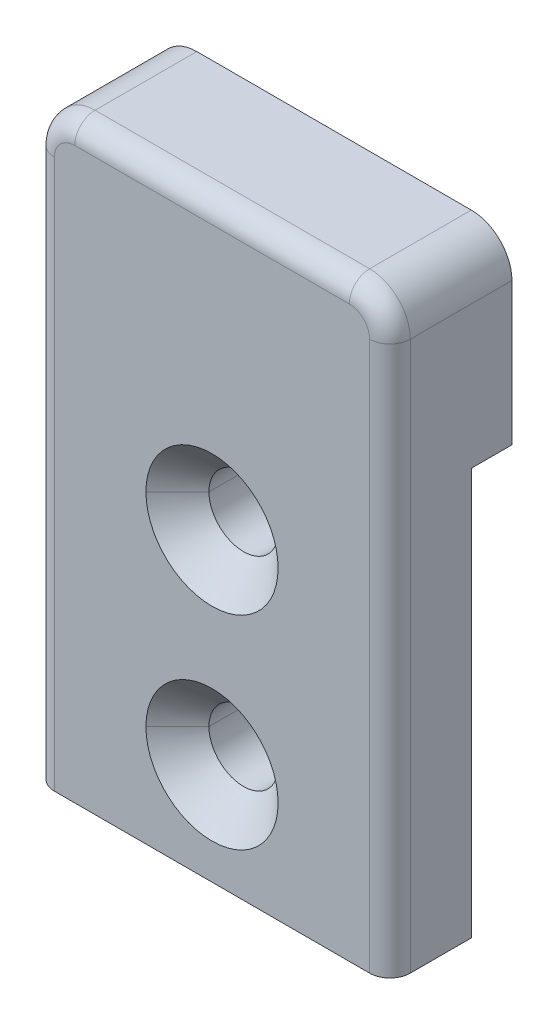
ISO-10303-21;
HEADER;
FILE_DESCRIPTION(('STEP AP214'),'2;1');
FILE_NAME('part.step','',(''),(''),'','','');
FILE_SCHEMA(('AUTOMOTIVE_DESIGN { 1 0 10303 214 1 1 1 1 }'));
ENDSEC;
DATA;
#1=APPLICATION_CONTEXT('core data for automotive mechanical design processes');
#2=APPLICATION_PROTOCOL_DEFINITION('international standard','automotive_design',2000,#1);
#3=PRODUCT_CONTEXT('',#1,'mechanical');
#4=PRODUCT('Part','Part','',(#3));
#5=PRODUCT_RELATED_PRODUCT_CATEGORY('part','',(#4));
#6=PRODUCT_DEFINITION_FORMATION('','',#4);
#7=PRODUCT_DEFINITION_CONTEXT('part definition',#1,'design');
#8=PRODUCT_DEFINITION('design','',#6,#7);
#9=PRODUCT_DEFINITION_SHAPE('','',#8);
#10=(LENGTH_UNIT() NAMED_UNIT(*) SI_UNIT(.MILLI.,.METRE.));
#11=(NAMED_UNIT(*) PLANE_ANGLE_UNIT() SI_UNIT($,.RADIAN.));
#12=(NAMED_UNIT(*) SI_UNIT($,.STERADIAN.) SOLID_ANGLE_UNIT());
#13=UNCERTAINTY_MEASURE_WITH_UNIT(LENGTH_MEASURE(1.E-05),#10,'distance_accuracy_value','');
#14=(GEOMETRIC_REPRESENTATION_CONTEXT(3) GLOBAL_UNCERTAINTY_ASSIGNED_CONTEXT((#13)) GLOBAL_UNIT_ASSIGNED_CONTEXT((#10,
#11,#12)) REPRESENTATION_CONTEXT('',''));
#15=CARTESIAN_POINT('',(0.,0.,0.));
#16=DIRECTION('',(0.,0.,1.));
#17=DIRECTION('',(1.,0.,0.));
#18=AXIS2_PLACEMENT_3D('',#15,#16,#17);
#19=CARTESIAN_POINT('',(-10.,10.,0.));
#20=DIRECTION('',(0.,1.,0.));
#21=DIRECTION('',(0.,0.,-1.));
#22=AXIS2_PLACEMENT_3D('',#19,#20,#21);
#23=PLANE('',#22);
#24=DIRECTION('',(0.,0.,1.));
#25=VECTOR('',#24,1.);
#26=CARTESIAN_POINT('',(7.5,10.,0.));
#27=LINE('',#26,#25);
#28=CARTESIAN_POINT('',(7.5,10.,0.));
#29=VERTEX_POINT('',#28);
#30=CARTESIAN_POINT('',(7.5,10.,2.));
#31=VERTEX_POINT('',#30);
#32=EDGE_CURVE('E299',#29,#31,#27,.T.);
#33=ORIENTED_EDGE('',*,*,#32,.T.);
#34=DIRECTION('',(1.,0.,0.));
#35=VECTOR('',#34,1.);
#36=CARTESIAN_POINT('',(-10.,10.,2.));
#37=LINE('',#36,#35);
#38=CARTESIAN_POINT('',(-10.,10.,2.));
#39=VERTEX_POINT('',#38);
#40=EDGE_CURVE('E11',#39,#31,#37,.T.);
#41=ORIENTED_EDGE('',*,*,#40,.F.);
#42=DIRECTION('',(0.,0.,1.));
#43=VECTOR('',#42,1.);
#44=CARTESIAN_POINT('',(-10.,10.,0.));
#45=LINE('',#44,#43);
#46=CARTESIAN_POINT('',(-10.,10.,0.));
#47=VERTEX_POINT('',#46);
#48=EDGE_CURVE('E239',#47,#39,#45,.T.);
#49=ORIENTED_EDGE('',*,*,#48,.F.);
#50=DIRECTION('',(1.,0.,0.));
#51=VECTOR('',#50,1.);
#52=CARTESIAN_POINT('',(-10.,10.,0.));
#53=LINE('',#52,#51);
#54=EDGE_CURVE('E242',#47,#29,#53,.T.);
#55=ORIENTED_EDGE('',*,*,#54,.T.);
#56=EDGE_LOOP('',(#33,#41,#49,#55));
#57=FACE_BOUND('',#56,.T.);
#58=ADVANCED_FACE('F17',(#57),#23,.F.);
#59=CARTESIAN_POINT('',(-10.,10.,2.));
#60=DIRECTION('',(0.,0.,1.));
#61=DIRECTION('',(0.,-1.,0.));
#62=AXIS2_PLACEMENT_3D('',#59,#60,#61);
#63=PLANE('',#62);
#64=CARTESIAN_POINT('',(-1.24999999999986,-5.,2.));
#65=DIRECTION('',(0.,0.,-1.));
#66=DIRECTION('',(0.,-1.,0.));
#67=AXIS2_PLACEMENT_3D('',#64,#65,#66);
#68=CIRCLE('',#67,1.7);
#69=CARTESIAN_POINT('',(0.450000000000135,-5.,2.));
#70=VERTEX_POINT('',#69);
#71=CARTESIAN_POINT('',(-2.94999999999987,-5.,2.));
#72=VERTEX_POINT('',#71);
#73=EDGE_CURVE('E439',#70,#72,#68,.T.);
#74=ORIENTED_EDGE('',*,*,#73,.F.);
#75=CARTESIAN_POINT('',(-1.24999999999986,-5.,2.));
#76=DIRECTION('',(0.,0.,-1.));
#77=DIRECTION('',(0.,-1.,0.));
#78=AXIS2_PLACEMENT_3D('',#75,#76,#77);
#79=CIRCLE('',#78,1.7);
#80=EDGE_CURVE('E364',#72,#70,#79,.T.);
#81=ORIENTED_EDGE('',*,*,#80,.F.);
#82=EDGE_LOOP('',(#74,#81));
#83=FACE_BOUND('',#82,.T.);
#84=CARTESIAN_POINT('',(-1.24999999999987,5.,2.));
#85=DIRECTION('',(0.,0.,-1.));
#86=DIRECTION('',(0.,-1.,0.));
#87=AXIS2_PLACEMENT_3D('',#84,#85,#86);
#88=CIRCLE('',#87,1.7);
#89=CARTESIAN_POINT('',(0.450000000000133,5.,2.));
#90=VERTEX_POINT('',#89);
#91=CARTESIAN_POINT('',(-2.94999999999987,5.,2.));
#92=VERTEX_POINT('',#91);
#93=EDGE_CURVE('E418',#90,#92,#88,.T.);
#94=ORIENTED_EDGE('',*,*,#93,.F.);
#95=CARTESIAN_POINT('',(-1.24999999999987,5.,2.));
#96=DIRECTION('',(0.,0.,-1.));
#97=DIRECTION('',(0.,-1.,0.));
#98=AXIS2_PLACEMENT_3D('',#95,#96,#97);
#99=CIRCLE('',#98,1.7);
#100=EDGE_CURVE('E342',#92,#90,#99,.T.);
#101=ORIENTED_EDGE('',*,*,#100,.F.);
#102=EDGE_LOOP('',(#94,#101));
#103=FACE_BOUND('',#102,.T.);
#104=DIRECTION('',(0.,-1.,0.));
#105=VECTOR('',#104,1.);
#106=CARTESIAN_POINT('',(7.5,10.,2.));
#107=LINE('',#106,#105);
#108=CARTESIAN_POINT('',(7.5,-10.,2.));
#109=VERTEX_POINT('',#108);
#110=EDGE_CURVE('E296',#31,#109,#107,.T.);
#111=ORIENTED_EDGE('',*,*,#110,.T.);
#112=DIRECTION('',(1.,0.,0.));
#113=VECTOR('',#112,1.);
#114=CARTESIAN_POINT('',(-10.,-10.,2.));
#115=LINE('',#114,#113);
#116=CARTESIAN_POINT('',(-10.,-10.,2.));
#117=VERTEX_POINT('',#116);
#118=EDGE_CURVE('E275',#117,#109,#115,.T.);
#119=ORIENTED_EDGE('',*,*,#118,.F.);
#120=DIRECTION('',(0.,-1.,0.));
#121=VECTOR('',#120,1.);
#122=CARTESIAN_POINT('',(-10.,10.,2.));
#123=LINE('',#122,#121);
#124=EDGE_CURVE('E307',#39,#117,#123,.T.);
#125=ORIENTED_EDGE('',*,*,#124,.F.);
#126=ORIENTED_EDGE('',*,*,#40,.T.);
#127=EDGE_LOOP('',(#111,#119,#125,#126));
#128=FACE_BOUND('',#127,.T.);
#129=ADVANCED_FACE('F567',(#83,#103,#128),#63,.F.);
#130=CARTESIAN_POINT('',(6.5,0.,5.));
#131=DIRECTION('',(0.,1.,0.));
#132=DIRECTION('',(-1.,0.,0.));
#133=AXIS2_PLACEMENT_3D('',#130,#131,#132);
#134=CYLINDRICAL_SURFACE('',#133,1.);
#135=CARTESIAN_POINT('',(6.5,-10.,5.));
#136=DIRECTION('',(0.,-1.,0.));
#137=DIRECTION('',(-1.,0.,0.));
#138=AXIS2_PLACEMENT_3D('',#135,#136,#137);
#139=CIRCLE('',#138,1.);
#140=CARTESIAN_POINT('',(7.5,-10.,5.));
#141=VERTEX_POINT('',#140);
#142=CARTESIAN_POINT('',(6.5,-10.,6.));
#143=VERTEX_POINT('',#142);
#144=EDGE_CURVE('E288',#141,#143,#139,.T.);
#145=ORIENTED_EDGE('',*,*,#144,.F.);
#146=DIRECTION('',(0.,-1.,0.));
#147=VECTOR('',#146,1.);
#148=CARTESIAN_POINT('',(7.5,10.,5.));
#149=LINE('',#148,#147);
#150=CARTESIAN_POINT('',(7.5,17.,5.));
#151=VERTEX_POINT('',#150);
#152=EDGE_CURVE('E278',#151,#141,#149,.T.);
#153=ORIENTED_EDGE('',*,*,#152,.F.);
#154=CARTESIAN_POINT('',(6.5,17.,5.));
#155=DIRECTION('',(0.,-1.,0.));
#156=DIRECTION('',(0.,0.,-1.));
#157=AXIS2_PLACEMENT_3D('',#154,#155,#156);
#158=CIRCLE('',#157,1.);
#159=CARTESIAN_POINT('',(6.5,17.,6.));
#160=VERTEX_POINT('',#159);
#161=EDGE_CURVE('E20',#151,#160,#158,.T.);
#162=ORIENTED_EDGE('',*,*,#161,.T.);
#163=DIRECTION('',(0.,1.,0.));
#164=VECTOR('',#163,1.);
#165=CARTESIAN_POINT('',(6.5,0.,6.));
#166=LINE('',#165,#164);
#167=EDGE_CURVE('E281',#143,#160,#166,.T.);
#168=ORIENTED_EDGE('',*,*,#167,.F.);
#169=EDGE_LOOP('',(#145,#153,#162,#168));
#170=FACE_BOUND('',#169,.T.);
#171=ADVANCED_FACE('F386',(#170),#134,.T.);
#172=CARTESIAN_POINT('',(5.5,17.,5.));
#173=DIRECTION('',(0.,0.,-1.));
#174=DIRECTION('',(-1.,0.,0.));
#175=AXIS2_PLACEMENT_3D('',#172,#173,#174);
#176=DEGENERATE_TOROIDAL_SURFACE('',#175,1.,1.,.T.);
#177=CARTESIAN_POINT('',(5.5,18.,5.));
#178=DIRECTION('',(1.,0.,0.));
#179=DIRECTION('',(0.,0.,-1.));
#180=AXIS2_PLACEMENT_3D('',#177,#178,#179);
#181=CIRCLE('',#180,1.);
#182=CARTESIAN_POINT('',(5.5,19.,5.));
#183=VERTEX_POINT('',#182);
#184=CARTESIAN_POINT('',(5.5,18.,6.));
#185=VERTEX_POINT('',#184);
#186=EDGE_CURVE('E371',#183,#185,#181,.T.);
#187=ORIENTED_EDGE('',*,*,#186,.T.);
#188=CARTESIAN_POINT('',(5.5,17.,6.));
#189=DIRECTION('',(0.,0.,1.));
#190=DIRECTION('',(-1.,0.,0.));
#191=AXIS2_PLACEMENT_3D('',#188,#189,#190);
#192=CIRCLE('',#191,1.);
#193=EDGE_CURVE('E292',#160,#185,#192,.T.);
#194=ORIENTED_EDGE('',*,*,#193,.F.);
#195=ORIENTED_EDGE('',*,*,#161,.F.);
#196=CARTESIAN_POINT('',(5.5,17.,5.));
#197=DIRECTION('',(0.,0.,-1.));
#198=DIRECTION('',(-1.,0.,0.));
#199=AXIS2_PLACEMENT_3D('',#196,#197,#198);
#200=CIRCLE('',#199,2.);
#201=EDGE_CURVE('E341',#183,#151,#200,.T.);
#202=ORIENTED_EDGE('',*,*,#201,.F.);
#203=EDGE_LOOP('',(#187,#194,#195,#202));
#204=FACE_BOUND('',#203,.T.);
#205=ADVANCED_FACE('F388',(#204),#176,.T.);
#206=CARTESIAN_POINT('',(0.,18.,5.));
#207=DIRECTION('',(-1.,0.,0.));
#208=DIRECTION('',(0.,-1.,0.));
#209=AXIS2_PLACEMENT_3D('',#206,#207,#208);
#210=CYLINDRICAL_SURFACE('',#209,1.);
#211=CARTESIAN_POINT('',(-8.,18.,5.));
#212=DIRECTION('',(1.,0.,0.));
#213=DIRECTION('',(0.,0.,-1.));
#214=AXIS2_PLACEMENT_3D('',#211,#212,#213);
#215=CIRCLE('',#214,1.);
#216=CARTESIAN_POINT('',(-8.,19.,5.));
#217=VERTEX_POINT('',#216);
#218=CARTESIAN_POINT('',(-8.,18.,6.));
#219=VERTEX_POINT('',#218);
#220=EDGE_CURVE('E87',#217,#219,#215,.T.);
#221=ORIENTED_EDGE('',*,*,#220,.T.);
#222=DIRECTION('',(-1.,0.,0.));
#223=VECTOR('',#222,1.);
#224=CARTESIAN_POINT('',(-8.,18.,6.));
#225=LINE('',#224,#223);
#226=EDGE_CURVE('E316',#185,#219,#225,.T.);
#227=ORIENTED_EDGE('',*,*,#226,.F.);
#228=ORIENTED_EDGE('',*,*,#186,.F.);
#229=DIRECTION('',(1.,0.,0.));
#230=VECTOR('',#229,1.);
#231=CARTESIAN_POINT('',(5.5,19.,5.));
#232=LINE('',#231,#230);
#233=EDGE_CURVE('E347',#217,#183,#232,.T.);
#234=ORIENTED_EDGE('',*,*,#233,.F.);
#235=EDGE_LOOP('',(#221,#227,#228,#234));
#236=FACE_BOUND('',#235,.T.);
#237=ADVANCED_FACE('F581',(#236),#210,.T.);
#238=CARTESIAN_POINT('',(-8.,17.,5.));
#239=DIRECTION('',(0.,0.,-1.));
#240=DIRECTION('',(-1.,0.,0.));
#241=AXIS2_PLACEMENT_3D('',#238,#239,#240);
#242=DEGENERATE_TOROIDAL_SURFACE('',#241,1.,1.,.T.);
#243=CARTESIAN_POINT('',(-9.,17.,5.));
#244=DIRECTION('',(0.,1.,0.));
#245=DIRECTION('',(0.,0.,1.));
#246=AXIS2_PLACEMENT_3D('',#243,#244,#245);
#247=CIRCLE('',#246,1.);
#248=CARTESIAN_POINT('',(-10.,17.,5.));
#249=VERTEX_POINT('',#248);
#250=CARTESIAN_POINT('',(-9.,17.,6.));
#251=VERTEX_POINT('',#250);
#252=EDGE_CURVE('E39',#249,#251,#247,.T.);
#253=ORIENTED_EDGE('',*,*,#252,.T.);
#254=CARTESIAN_POINT('',(-8.,17.,6.));
#255=DIRECTION('',(0.,0.,1.));
#256=DIRECTION('',(-1.,0.,0.));
#257=AXIS2_PLACEMENT_3D('',#254,#255,#256);
#258=CIRCLE('',#257,1.);
#259=EDGE_CURVE('E311',#219,#251,#258,.T.);
#260=ORIENTED_EDGE('',*,*,#259,.F.);
#261=ORIENTED_EDGE('',*,*,#220,.F.);
#262=CARTESIAN_POINT('',(-8.,17.,5.));
#263=DIRECTION('',(0.,0.,-1.));
#264=DIRECTION('',(-1.,0.,0.));
#265=AXIS2_PLACEMENT_3D('',#262,#263,#264);
#266=CIRCLE('',#265,2.);
#267=EDGE_CURVE('E354',#249,#217,#266,.T.);
#268=ORIENTED_EDGE('',*,*,#267,.F.);
#269=EDGE_LOOP('',(#253,#260,#261,#268));
#270=FACE_BOUND('',#269,.T.);
#271=ADVANCED_FACE('F584',(#270),#242,.T.);
#272=CARTESIAN_POINT('',(-9.,0.,5.));
#273=DIRECTION('',(0.,-1.,0.));
#274=DIRECTION('',(1.,0.,0.));
#275=AXIS2_PLACEMENT_3D('',#272,#273,#274);
#276=CYLINDRICAL_SURFACE('',#275,1.);
#277=CARTESIAN_POINT('',(-9.,-10.,5.));
#278=DIRECTION('',(0.,-1.,0.));
#279=DIRECTION('',(-1.,0.,0.));
#280=AXIS2_PLACEMENT_3D('',#277,#278,#279);
#281=CIRCLE('',#280,1.);
#282=CARTESIAN_POINT('',(-9.,-10.,6.));
#283=VERTEX_POINT('',#282);
#284=CARTESIAN_POINT('',(-10.,-10.,5.));
#285=VERTEX_POINT('',#284);
#286=EDGE_CURVE('E287',#283,#285,#281,.T.);
#287=ORIENTED_EDGE('',*,*,#286,.F.);
#288=DIRECTION('',(0.,-1.,0.));
#289=VECTOR('',#288,1.);
#290=CARTESIAN_POINT('',(-9.,-10.,6.));
#291=LINE('',#290,#289);
#292=EDGE_CURVE('E315',#251,#283,#291,.T.);
#293=ORIENTED_EDGE('',*,*,#292,.F.);
#294=ORIENTED_EDGE('',*,*,#252,.F.);
#295=DIRECTION('',(0.,1.,0.));
#296=VECTOR('',#295,1.);
#297=CARTESIAN_POINT('',(-10.,17.,5.));
#298=LINE('',#297,#296);
#299=EDGE_CURVE('E310',#285,#249,#298,.T.);
#300=ORIENTED_EDGE('',*,*,#299,.F.);
#301=EDGE_LOOP('',(#287,#293,#294,#300));
#302=FACE_BOUND('',#301,.T.);
#303=ADVANCED_FACE('F588',(#302),#276,.T.);
#304=CARTESIAN_POINT('',(-8.,17.,0.));
#305=DIRECTION('',(0.,0.,-1.));
#306=DIRECTION('',(-1.,0.,0.));
#307=AXIS2_PLACEMENT_3D('',#304,#305,#306);
#308=CYLINDRICAL_SURFACE('',#307,2.);
#309=DIRECTION('',(0.,0.,-1.));
#310=VECTOR('',#309,1.);
#311=CARTESIAN_POINT('',(-10.,17.,0.));
#312=LINE('',#311,#310);
#313=CARTESIAN_POINT('',(-10.,17.,0.));
#314=VERTEX_POINT('',#313);
#315=EDGE_CURVE('E248',#249,#314,#312,.T.);
#316=ORIENTED_EDGE('',*,*,#315,.F.);
#317=ORIENTED_EDGE('',*,*,#267,.T.);
#318=DIRECTION('',(0.,0.,1.));
#319=VECTOR('',#318,1.);
#320=CARTESIAN_POINT('',(-8.,19.,0.));
#321=LINE('',#320,#319);
#322=CARTESIAN_POINT('',(-8.,19.,0.));
#323=VERTEX_POINT('',#322);
#324=EDGE_CURVE('E330',#323,#217,#321,.T.);
#325=ORIENTED_EDGE('',*,*,#324,.F.);
#326=CARTESIAN_POINT('',(-8.,17.,0.));
#327=DIRECTION('',(0.,0.,-1.));
#328=DIRECTION('',(-1.,0.,0.));
#329=AXIS2_PLACEMENT_3D('',#326,#327,#328);
#330=CIRCLE('',#329,2.);
#331=EDGE_CURVE('E259',#314,#323,#330,.T.);
#332=ORIENTED_EDGE('',*,*,#331,.F.);
#333=EDGE_LOOP('',(#316,#317,#325,#332));
#334=FACE_BOUND('',#333,.T.);
#335=ADVANCED_FACE('F591',(#334),#308,.T.);
#336=CARTESIAN_POINT('',(5.5,17.,0.));
#337=DIRECTION('',(0.,0.,1.));
#338=DIRECTION('',(1.,0.,0.));
#339=AXIS2_PLACEMENT_3D('',#336,#337,#338);
#340=CYLINDRICAL_SURFACE('',#339,2.);
#341=DIRECTION('',(0.,0.,-1.));
#342=VECTOR('',#341,1.);
#343=CARTESIAN_POINT('',(5.5,19.,0.));
#344=LINE('',#343,#342);
#345=CARTESIAN_POINT('',(5.5,19.,0.));
#346=VERTEX_POINT('',#345);
#347=EDGE_CURVE('E75',#183,#346,#344,.T.);
#348=ORIENTED_EDGE('',*,*,#347,.F.);
#349=ORIENTED_EDGE('',*,*,#201,.T.);
#350=DIRECTION('',(0.,0.,1.));
#351=VECTOR('',#350,1.);
#352=CARTESIAN_POINT('',(7.5,17.,6.));
#353=LINE('',#352,#351);
#354=CARTESIAN_POINT('',(7.5,17.,0.));
#355=VERTEX_POINT('',#354);
#356=EDGE_CURVE('E282',#355,#151,#353,.T.);
#357=ORIENTED_EDGE('',*,*,#356,.F.);
#358=CARTESIAN_POINT('',(5.5,17.,0.));
#359=DIRECTION('',(0.,0.,-1.));
#360=DIRECTION('',(-1.,0.,0.));
#361=AXIS2_PLACEMENT_3D('',#358,#359,#360);
#362=CIRCLE('',#361,2.);
#363=EDGE_CURVE('E337',#346,#355,#362,.T.);
#364=ORIENTED_EDGE('',*,*,#363,.F.);
#365=EDGE_LOOP('',(#348,#349,#357,#364));
#366=FACE_BOUND('',#365,.T.);
#367=ADVANCED_FACE('F594',(#366),#340,.T.);
#368=CARTESIAN_POINT('',(-1.24999999999987,5.,6.));
#369=DIRECTION('',(0.,0.,1.));
#370=DIRECTION('',(1.,0.,0.));
#371=AXIS2_PLACEMENT_3D('',#368,#369,#370);
#372=CONICAL_SURFACE('',#371,3.25,0.785398163397449);
#373=DIRECTION('',(-0.707106781186548,0.,0.707106781186547));
#374=VECTOR('',#373,1.);
#375=CARTESIAN_POINT('',(-4.49999999999986,5.,6.));
#376=LINE('',#375,#374);
#377=CARTESIAN_POINT('',(-2.94999999999987,5.,4.45));
#378=VERTEX_POINT('',#377);
#379=CARTESIAN_POINT('',(-4.49999999999986,5.,6.));
#380=VERTEX_POINT('',#379);
#381=EDGE_CURVE('E417',#378,#380,#376,.T.);
#382=ORIENTED_EDGE('',*,*,#381,.F.);
#383=CARTESIAN_POINT('',(-1.24999999999987,5.,4.45));
#384=DIRECTION('',(0.,0.,1.));
#385=DIRECTION('',(1.,0.,0.));
#386=AXIS2_PLACEMENT_3D('',#383,#384,#385);
#387=CIRCLE('',#386,1.7);
#388=CARTESIAN_POINT('',(0.450000000000133,5.,4.45));
#389=VERTEX_POINT('',#388);
#390=EDGE_CURVE('E338',#389,#378,#387,.T.);
#391=ORIENTED_EDGE('',*,*,#390,.F.);
#392=DIRECTION('',(0.707106781186548,0.,0.707106781186547));
#393=VECTOR('',#392,1.);
#394=CARTESIAN_POINT('',(2.00000000000014,5.,6.));
#395=LINE('',#394,#393);
#396=CARTESIAN_POINT('',(2.00000000000014,5.,6.));
#397=VERTEX_POINT('',#396);
#398=EDGE_CURVE('E416',#389,#397,#395,.T.);
#399=ORIENTED_EDGE('',*,*,#398,.T.);
#400=CARTESIAN_POINT('',(-1.24999999999987,5.,6.));
#401=DIRECTION('',(0.,0.,1.));
#402=DIRECTION('',(1.,0.,0.));
#403=AXIS2_PLACEMENT_3D('',#400,#401,#402);
#404=CIRCLE('',#403,3.25);
#405=EDGE_CURVE('E272',#397,#380,#404,.T.);
#406=ORIENTED_EDGE('',*,*,#405,.T.);
#407=EDGE_LOOP('',(#382,#391,#399,#406));
#408=FACE_BOUND('',#407,.T.);
#409=ADVANCED_FACE('F598',(#408),#372,.F.);
#410=CARTESIAN_POINT('',(-1.24999999999987,5.,6.));
#411=DIRECTION('',(0.,0.,1.));
#412=DIRECTION('',(1.,0.,0.));
#413=AXIS2_PLACEMENT_3D('',#410,#411,#412);
#414=CYLINDRICAL_SURFACE('',#413,1.7);
#415=DIRECTION('',(0.,0.,1.));
#416=VECTOR('',#415,1.);
#417=CARTESIAN_POINT('',(-2.94999999999987,5.,6.));
#418=LINE('',#417,#416);
#419=EDGE_CURVE('E422',#92,#378,#418,.T.);
#420=ORIENTED_EDGE('',*,*,#419,.F.);
#421=ORIENTED_EDGE('',*,*,#100,.T.);
#422=DIRECTION('',(0.,0.,1.));
#423=VECTOR('',#422,1.);
#424=CARTESIAN_POINT('',(0.450000000000133,5.,6.));
#425=LINE('',#424,#423);
#426=EDGE_CURVE('E431',#90,#389,#425,.T.);
#427=ORIENTED_EDGE('',*,*,#426,.T.);
#428=ORIENTED_EDGE('',*,*,#390,.T.);
#429=EDGE_LOOP('',(#420,#421,#427,#428));
#430=FACE_BOUND('',#429,.T.);
#431=ADVANCED_FACE('F638',(#430),#414,.F.);
#432=CARTESIAN_POINT('',(-1.24999999999986,-5.,6.));
#433=DIRECTION('',(0.,0.,1.));
#434=DIRECTION('',(1.,0.,0.));
#435=AXIS2_PLACEMENT_3D('',#432,#433,#434);
#436=CONICAL_SURFACE('',#435,3.25,0.785398163397449);
#437=DIRECTION('',(-0.707106781186548,0.,0.707106781186547));
#438=VECTOR('',#437,1.);
#439=CARTESIAN_POINT('',(-4.49999999999986,-5.,6.));
#440=LINE('',#439,#438);
#441=CARTESIAN_POINT('',(-2.94999999999987,-5.,4.45));
#442=VERTEX_POINT('',#441);
#443=CARTESIAN_POINT('',(-4.49999999999986,-5.,6.));
#444=VERTEX_POINT('',#443);
#445=EDGE_CURVE('E445',#442,#444,#440,.T.);
#446=ORIENTED_EDGE('',*,*,#445,.F.);
#447=CARTESIAN_POINT('',(-1.24999999999986,-5.,4.45));
#448=DIRECTION('',(0.,0.,1.));
#449=DIRECTION('',(1.,0.,0.));
#450=AXIS2_PLACEMENT_3D('',#447,#448,#449);
#451=CIRCLE('',#450,1.7);
#452=CARTESIAN_POINT('',(0.450000000000135,-5.,4.45));
#453=VERTEX_POINT('',#452);
#454=EDGE_CURVE('E365',#453,#442,#451,.T.);
#455=ORIENTED_EDGE('',*,*,#454,.F.);
#456=DIRECTION('',(0.707106781186548,0.,0.707106781186547));
#457=VECTOR('',#456,1.);
#458=CARTESIAN_POINT('',(2.00000000000014,-5.,6.));
#459=LINE('',#458,#457);
#460=CARTESIAN_POINT('',(2.00000000000014,-5.,6.));
#461=VERTEX_POINT('',#460);
#462=EDGE_CURVE('E411',#453,#461,#459,.T.);
#463=ORIENTED_EDGE('',*,*,#462,.T.);
#464=CARTESIAN_POINT('',(-1.24999999999986,-5.,6.));
#465=DIRECTION('',(0.,0.,1.));
#466=DIRECTION('',(1.,0.,0.));
#467=AXIS2_PLACEMENT_3D('',#464,#465,#466);
#468=CIRCLE('',#467,3.25);
#469=EDGE_CURVE('E266',#461,#444,#468,.T.);
#470=ORIENTED_EDGE('',*,*,#469,.T.);
#471=EDGE_LOOP('',(#446,#455,#463,#470));
#472=FACE_BOUND('',#471,.T.);
#473=ADVANCED_FACE('F603',(#472),#436,.F.);
#474=CARTESIAN_POINT('',(-1.24999999999986,-5.,6.));
#475=DIRECTION('',(0.,0.,1.));
#476=DIRECTION('',(1.,0.,0.));
#477=AXIS2_PLACEMENT_3D('',#474,#475,#476);
#478=CYLINDRICAL_SURFACE('',#477,1.7);
#479=DIRECTION('',(0.,0.,1.));
#480=VECTOR('',#479,1.);
#481=CARTESIAN_POINT('',(-2.94999999999987,-5.,6.));
#482=LINE('',#481,#480);
#483=EDGE_CURVE('E435',#72,#442,#482,.T.);
#484=ORIENTED_EDGE('',*,*,#483,.F.);
#485=ORIENTED_EDGE('',*,*,#80,.T.);
#486=DIRECTION('',(0.,0.,1.));
#487=VECTOR('',#486,1.);
#488=CARTESIAN_POINT('',(0.450000000000135,-5.,6.));
#489=LINE('',#488,#487);
#490=EDGE_CURVE('E438',#70,#453,#489,.T.);
#491=ORIENTED_EDGE('',*,*,#490,.T.);
#492=ORIENTED_EDGE('',*,*,#454,.T.);
#493=EDGE_LOOP('',(#484,#485,#491,#492));
#494=FACE_BOUND('',#493,.T.);
#495=ADVANCED_FACE('F600',(#494),#478,.F.);
#496=CARTESIAN_POINT('',(4.,16.,0.500000000000007));
#497=DIRECTION('',(0.,0.,-1.));
#498=DIRECTION('',(-1.,0.,0.));
#499=AXIS2_PLACEMENT_3D('',#496,#497,#498);
#500=CONICAL_SURFACE('',#499,2.,0.785398163397448);
#501=DIRECTION('',(0.707106781186548,0.,-0.707106781186548));
#502=VECTOR('',#501,1.);
#503=CARTESIAN_POINT('',(6.,16.,0.500000000000007));
#504=LINE('',#503,#502);
#505=CARTESIAN_POINT('',(6.,16.,0.500000000000007));
#506=VERTEX_POINT('',#505);
#507=CARTESIAN_POINT('',(6.5,16.,0.));
#508=VERTEX_POINT('',#507);
#509=EDGE_CURVE('E472',#506,#508,#504,.T.);
#510=ORIENTED_EDGE('',*,*,#509,.F.);
#511=CARTESIAN_POINT('',(4.,16.,0.500000000000007));
#512=DIRECTION('',(0.,0.,-1.));
#513=DIRECTION('',(-1.,0.,0.));
#514=AXIS2_PLACEMENT_3D('',#511,#512,#513);
#515=CIRCLE('',#514,2.);
#516=CARTESIAN_POINT('',(2.,16.,0.500000000000007));
#517=VERTEX_POINT('',#516);
#518=EDGE_CURVE('E361',#517,#506,#515,.T.);
#519=ORIENTED_EDGE('',*,*,#518,.F.);
#520=DIRECTION('',(-0.707106781186548,0.,-0.707106781186548));
#521=VECTOR('',#520,1.);
#522=CARTESIAN_POINT('',(2.,16.,0.500000000000007));
#523=LINE('',#522,#521);
#524=CARTESIAN_POINT('',(1.5,16.,0.));
#525=VERTEX_POINT('',#524);
#526=EDGE_CURVE('E474',#517,#525,#523,.T.);
#527=ORIENTED_EDGE('',*,*,#526,.T.);
#528=CARTESIAN_POINT('',(4.,16.,0.));
#529=DIRECTION('',(0.,0.,1.));
#530=DIRECTION('',(-1.,0.,0.));
#531=AXIS2_PLACEMENT_3D('',#528,#529,#530);
#532=CIRCLE('',#531,2.5);
#533=EDGE_CURVE('E327',#508,#525,#532,.T.);
#534=ORIENTED_EDGE('',*,*,#533,.F.);
#535=EDGE_LOOP('',(#510,#519,#527,#534));
#536=FACE_BOUND('',#535,.T.);
#537=ADVANCED_FACE('F564',(#536),#500,.F.);
#538=CARTESIAN_POINT('',(-6.5,16.,0.500000000000007));
#539=DIRECTION('',(0.,0.,-1.));
#540=DIRECTION('',(-1.,0.,0.));
#541=AXIS2_PLACEMENT_3D('',#538,#539,#540);
#542=CONICAL_SURFACE('',#541,2.,0.785398163397448);
#543=DIRECTION('',(0.707106781186548,0.,-0.707106781186548));
#544=VECTOR('',#543,1.);
#545=CARTESIAN_POINT('',(-4.5,16.,0.500000000000007));
#546=LINE('',#545,#544);
#547=CARTESIAN_POINT('',(-4.5,16.,0.500000000000007));
#548=VERTEX_POINT('',#547);
#549=CARTESIAN_POINT('',(-4.,16.,0.));
#550=VERTEX_POINT('',#549);
#551=EDGE_CURVE('E482',#548,#550,#546,.T.);
#552=ORIENTED_EDGE('',*,*,#551,.F.);
#553=CARTESIAN_POINT('',(-6.5,16.,0.500000000000007));
#554=DIRECTION('',(0.,0.,-1.));
#555=DIRECTION('',(-1.,0.,0.));
#556=AXIS2_PLACEMENT_3D('',#553,#554,#555);
#557=CIRCLE('',#556,2.);
#558=CARTESIAN_POINT('',(-8.5,16.,0.500000000000007));
#559=VERTEX_POINT('',#558);
#560=EDGE_CURVE('E360',#559,#548,#557,.T.);
#561=ORIENTED_EDGE('',*,*,#560,.F.);
#562=DIRECTION('',(-0.707106781186548,0.,-0.707106781186548));
#563=VECTOR('',#562,1.);
#564=CARTESIAN_POINT('',(-8.5,16.,0.500000000000007));
#565=LINE('',#564,#563);
#566=CARTESIAN_POINT('',(-9.,16.,0.));
#567=VERTEX_POINT('',#566);
#568=EDGE_CURVE('E459',#559,#567,#565,.T.);
#569=ORIENTED_EDGE('',*,*,#568,.T.);
#570=CARTESIAN_POINT('',(-6.5,16.,0.));
#571=DIRECTION('',(0.,0.,1.));
#572=DIRECTION('',(-1.,0.,0.));
#573=AXIS2_PLACEMENT_3D('',#570,#571,#572);
#574=CIRCLE('',#573,2.5);
#575=EDGE_CURVE('E331',#550,#567,#574,.T.);
#576=ORIENTED_EDGE('',*,*,#575,.F.);
#577=EDGE_LOOP('',(#552,#561,#569,#576));
#578=FACE_BOUND('',#577,.T.);
#579=ADVANCED_FACE('F550',(#578),#542,.F.);
#580=CARTESIAN_POINT('',(-6.5,16.,2.5));
#581=DIRECTION('',(0.,0.,-1.));
#582=DIRECTION('',(0.,-1.,0.));
#583=AXIS2_PLACEMENT_3D('',#580,#581,#582);
#584=PLANE('',#583);
#585=CARTESIAN_POINT('',(-6.5,16.,2.5));
#586=DIRECTION('',(0.,0.,-1.));
#587=DIRECTION('',(-1.,0.,0.));
#588=AXIS2_PLACEMENT_3D('',#585,#586,#587);
#589=CIRCLE('',#588,2.);
#590=CARTESIAN_POINT('',(-8.5,16.,2.5));
#591=VERTEX_POINT('',#590);
#592=CARTESIAN_POINT('',(-4.5,16.,2.5));
#593=VERTEX_POINT('',#592);
#594=EDGE_CURVE('E357',#591,#593,#589,.T.);
#595=ORIENTED_EDGE('',*,*,#594,.T.);
#596=CARTESIAN_POINT('',(-6.5,16.,2.5));
#597=DIRECTION('',(0.,0.,-1.));
#598=DIRECTION('',(-1.,0.,0.));
#599=AXIS2_PLACEMENT_3D('',#596,#597,#598);
#600=CIRCLE('',#599,2.);
#601=EDGE_CURVE('E463',#593,#591,#600,.T.);
#602=ORIENTED_EDGE('',*,*,#601,.T.);
#603=EDGE_LOOP('',(#595,#602));
#604=FACE_BOUND('',#603,.T.);
#605=ADVANCED_FACE('F554',(#604),#584,.T.);
#606=CARTESIAN_POINT('',(-6.5,16.,2.5));
#607=DIRECTION('',(0.,0.,-1.));
#608=DIRECTION('',(-1.,0.,0.));
#609=AXIS2_PLACEMENT_3D('',#606,#607,#608);
#610=CYLINDRICAL_SURFACE('',#609,2.);
#611=DIRECTION('',(0.,0.,-1.));
#612=VECTOR('',#611,1.);
#613=CARTESIAN_POINT('',(-4.5,16.,2.5));
#614=LINE('',#613,#612);
#615=EDGE_CURVE('E492',#593,#548,#614,.T.);
#616=ORIENTED_EDGE('',*,*,#615,.F.);
#617=ORIENTED_EDGE('',*,*,#594,.F.);
#618=DIRECTION('',(0.,0.,-1.));
#619=VECTOR('',#618,1.);
#620=CARTESIAN_POINT('',(-8.5,16.,2.5));
#621=LINE('',#620,#619);
#622=EDGE_CURVE('E496',#591,#559,#621,.T.);
#623=ORIENTED_EDGE('',*,*,#622,.T.);
#624=ORIENTED_EDGE('',*,*,#560,.T.);
#625=EDGE_LOOP('',(#616,#617,#623,#624));
#626=FACE_BOUND('',#625,.T.);
#627=ADVANCED_FACE('F552',(#626),#610,.F.);
#628=CARTESIAN_POINT('',(4.,16.,2.5));
#629=DIRECTION('',(0.,0.,-1.));
#630=DIRECTION('',(0.,-1.,0.));
#631=AXIS2_PLACEMENT_3D('',#628,#629,#630);
#632=PLANE('',#631);
#633=CARTESIAN_POINT('',(4.,16.,2.5));
#634=DIRECTION('',(0.,0.,-1.));
#635=DIRECTION('',(-1.,0.,0.));
#636=AXIS2_PLACEMENT_3D('',#633,#634,#635);
#637=CIRCLE('',#636,2.);
#638=CARTESIAN_POINT('',(2.,16.,2.5));
#639=VERTEX_POINT('',#638);
#640=CARTESIAN_POINT('',(6.,16.,2.5));
#641=VERTEX_POINT('',#640);
#642=EDGE_CURVE('E247',#639,#641,#637,.T.);
#643=ORIENTED_EDGE('',*,*,#642,.T.);
#644=CARTESIAN_POINT('',(4.,16.,2.5));
#645=DIRECTION('',(0.,0.,-1.));
#646=DIRECTION('',(-1.,0.,0.));
#647=AXIS2_PLACEMENT_3D('',#644,#645,#646);
#648=CIRCLE('',#647,2.);
#649=EDGE_CURVE('E502',#641,#639,#648,.T.);
#650=ORIENTED_EDGE('',*,*,#649,.T.);
#651=EDGE_LOOP('',(#643,#650));
#652=FACE_BOUND('',#651,.T.);
#653=ADVANCED_FACE('F562',(#652),#632,.T.);
#654=CARTESIAN_POINT('',(4.,16.,2.5));
#655=DIRECTION('',(0.,0.,-1.));
#656=DIRECTION('',(-1.,0.,0.));
#657=AXIS2_PLACEMENT_3D('',#654,#655,#656);
#658=CYLINDRICAL_SURFACE('',#657,2.);
#659=DIRECTION('',(0.,0.,-1.));
#660=VECTOR('',#659,1.);
#661=CARTESIAN_POINT('',(6.,16.,2.5));
#662=LINE('',#661,#660);
#663=EDGE_CURVE('E506',#641,#506,#662,.T.);
#664=ORIENTED_EDGE('',*,*,#663,.F.);
#665=ORIENTED_EDGE('',*,*,#642,.F.);
#666=DIRECTION('',(0.,0.,-1.));
#667=VECTOR('',#666,1.);
#668=CARTESIAN_POINT('',(2.,16.,2.5));
#669=LINE('',#668,#667);
#670=EDGE_CURVE('E427',#639,#517,#669,.T.);
#671=ORIENTED_EDGE('',*,*,#670,.T.);
#672=ORIENTED_EDGE('',*,*,#518,.T.);
#673=EDGE_LOOP('',(#664,#665,#671,#672));
#674=FACE_BOUND('',#673,.T.);
#675=ADVANCED_FACE('F616',(#674),#658,.F.);
#676=CARTESIAN_POINT('',(-10.,0.,0.));
#677=DIRECTION('',(-1.,0.,0.));
#678=DIRECTION('',(0.,0.,1.));
#679=AXIS2_PLACEMENT_3D('',#676,#677,#678);
#680=PLANE('',#679);
#681=ORIENTED_EDGE('',*,*,#124,.T.);
#682=DIRECTION('',(0.,0.,1.));
#683=VECTOR('',#682,1.);
#684=CARTESIAN_POINT('',(-10.,-10.,0.));
#685=LINE('',#684,#683);
#686=EDGE_CURVE('E423',#117,#285,#685,.T.);
#687=ORIENTED_EDGE('',*,*,#686,.T.);
#688=ORIENTED_EDGE('',*,*,#299,.T.);
#689=ORIENTED_EDGE('',*,*,#315,.T.);
#690=DIRECTION('',(0.,-1.,0.));
#691=VECTOR('',#690,1.);
#692=CARTESIAN_POINT('',(-10.,19.,0.));
#693=LINE('',#692,#691);
#694=EDGE_CURVE('E251',#314,#47,#693,.T.);
#695=ORIENTED_EDGE('',*,*,#694,.T.);
#696=ORIENTED_EDGE('',*,*,#48,.T.);
#697=EDGE_LOOP('',(#681,#687,#688,#689,#695,#696));
#698=FACE_BOUND('',#697,.T.);
#699=ADVANCED_FACE('F252',(#698),#680,.T.);
#700=CARTESIAN_POINT('',(0.,19.,0.));
#701=DIRECTION('',(0.,1.,0.));
#702=DIRECTION('',(1.,0.,0.));
#703=AXIS2_PLACEMENT_3D('',#700,#701,#702);
#704=PLANE('',#703);
#705=ORIENTED_EDGE('',*,*,#324,.T.);
#706=ORIENTED_EDGE('',*,*,#233,.T.);
#707=ORIENTED_EDGE('',*,*,#347,.T.);
#708=DIRECTION('',(-1.,0.,0.));
#709=VECTOR('',#708,1.);
#710=CARTESIAN_POINT('',(7.5,19.,0.));
#711=LINE('',#710,#709);
#712=EDGE_CURVE('E334',#346,#323,#711,.T.);
#713=ORIENTED_EDGE('',*,*,#712,.T.);
#714=EDGE_LOOP('',(#705,#706,#707,#713));
#715=FACE_BOUND('',#714,.T.);
#716=ADVANCED_FACE('F623',(#715),#704,.T.);
#717=CARTESIAN_POINT('',(0.,0.,0.));
#718=DIRECTION('',(0.,0.,-1.));
#719=DIRECTION('',(0.,-1.,0.));
#720=AXIS2_PLACEMENT_3D('',#717,#718,#719);
#721=PLANE('',#720);
#722=CARTESIAN_POINT('',(4.,16.,0.));
#723=DIRECTION('',(0.,0.,1.));
#724=DIRECTION('',(-1.,0.,0.));
#725=AXIS2_PLACEMENT_3D('',#722,#723,#724);
#726=CIRCLE('',#725,2.5);
#727=EDGE_CURVE('E479',#525,#508,#726,.T.);
#728=ORIENTED_EDGE('',*,*,#727,.T.);
#729=ORIENTED_EDGE('',*,*,#533,.T.);
#730=EDGE_LOOP('',(#728,#729));
#731=FACE_BOUND('',#730,.T.);
#732=CARTESIAN_POINT('',(-6.5,16.,0.));
#733=DIRECTION('',(0.,0.,1.));
#734=DIRECTION('',(-1.,0.,0.));
#735=AXIS2_PLACEMENT_3D('',#732,#733,#734);
#736=CIRCLE('',#735,2.5);
#737=EDGE_CURVE('E464',#567,#550,#736,.T.);
#738=ORIENTED_EDGE('',*,*,#737,.T.);
#739=ORIENTED_EDGE('',*,*,#575,.T.);
#740=EDGE_LOOP('',(#738,#739));
#741=FACE_BOUND('',#740,.T.);
#742=ORIENTED_EDGE('',*,*,#54,.F.);
#743=ORIENTED_EDGE('',*,*,#694,.F.);
#744=ORIENTED_EDGE('',*,*,#331,.T.);
#745=ORIENTED_EDGE('',*,*,#712,.F.);
#746=ORIENTED_EDGE('',*,*,#363,.T.);
#747=DIRECTION('',(0.,1.,0.));
#748=VECTOR('',#747,1.);
#749=CARTESIAN_POINT('',(7.5,10.,0.));
#750=LINE('',#749,#748);
#751=EDGE_CURVE('E263',#29,#355,#750,.T.);
#752=ORIENTED_EDGE('',*,*,#751,.F.);
#753=EDGE_LOOP('',(#742,#743,#744,#745,#746,#752));
#754=FACE_BOUND('',#753,.T.);
#755=ADVANCED_FACE('F261',(#731,#741,#754),#721,.T.);
#756=CARTESIAN_POINT('',(0.,0.,6.));
#757=DIRECTION('',(0.,0.,-1.));
#758=DIRECTION('',(0.,-1.,0.));
#759=AXIS2_PLACEMENT_3D('',#756,#757,#758);
#760=PLANE('',#759);
#761=ORIENTED_EDGE('',*,*,#469,.F.);
#762=CARTESIAN_POINT('',(-1.24999999999986,-5.,6.));
#763=DIRECTION('',(0.,0.,1.));
#764=DIRECTION('',(1.,0.,0.));
#765=AXIS2_PLACEMENT_3D('',#762,#763,#764);
#766=CIRCLE('',#765,3.25);
#767=EDGE_CURVE('E441',#444,#461,#766,.T.);
#768=ORIENTED_EDGE('',*,*,#767,.F.);
#769=EDGE_LOOP('',(#761,#768));
#770=FACE_BOUND('',#769,.T.);
#771=ORIENTED_EDGE('',*,*,#405,.F.);
#772=CARTESIAN_POINT('',(-1.24999999999987,5.,6.));
#773=DIRECTION('',(0.,0.,1.));
#774=DIRECTION('',(1.,0.,0.));
#775=AXIS2_PLACEMENT_3D('',#772,#773,#774);
#776=CIRCLE('',#775,3.25);
#777=EDGE_CURVE('E413',#380,#397,#776,.T.);
#778=ORIENTED_EDGE('',*,*,#777,.F.);
#779=EDGE_LOOP('',(#771,#778));
#780=FACE_BOUND('',#779,.T.);
#781=DIRECTION('',(1.,0.,0.));
#782=VECTOR('',#781,1.);
#783=CARTESIAN_POINT('',(7.5,-10.,6.));
#784=LINE('',#783,#782);
#785=EDGE_CURVE('E283',#283,#143,#784,.T.);
#786=ORIENTED_EDGE('',*,*,#785,.T.);
#787=ORIENTED_EDGE('',*,*,#167,.T.);
#788=ORIENTED_EDGE('',*,*,#193,.T.);
#789=ORIENTED_EDGE('',*,*,#226,.T.);
#790=ORIENTED_EDGE('',*,*,#259,.T.);
#791=ORIENTED_EDGE('',*,*,#292,.T.);
#792=EDGE_LOOP('',(#786,#787,#788,#789,#790,#791));
#793=FACE_BOUND('',#792,.T.);
#794=ADVANCED_FACE('F390',(#770,#780,#793),#760,.F.);
#795=CARTESIAN_POINT('',(7.5,10.,6.));
#796=DIRECTION('',(-1.,0.,0.));
#797=DIRECTION('',(0.,1.,0.));
#798=AXIS2_PLACEMENT_3D('',#795,#796,#797);
#799=PLANE('',#798);
#800=DIRECTION('',(0.,0.,-1.));
#801=VECTOR('',#800,1.);
#802=CARTESIAN_POINT('',(7.5,-10.,6.));
#803=LINE('',#802,#801);
#804=EDGE_CURVE('E400',#141,#109,#803,.T.);
#805=ORIENTED_EDGE('',*,*,#804,.T.);
#806=ORIENTED_EDGE('',*,*,#110,.F.);
#807=ORIENTED_EDGE('',*,*,#32,.F.);
#808=ORIENTED_EDGE('',*,*,#751,.T.);
#809=ORIENTED_EDGE('',*,*,#356,.T.);
#810=ORIENTED_EDGE('',*,*,#152,.T.);
#811=EDGE_LOOP('',(#805,#806,#807,#808,#809,#810));
#812=FACE_BOUND('',#811,.T.);
#813=ADVANCED_FACE('F648',(#812),#799,.F.);
#814=CARTESIAN_POINT('',(7.5,-10.,6.));
#815=DIRECTION('',(0.,1.,0.));
#816=DIRECTION('',(1.,0.,0.));
#817=AXIS2_PLACEMENT_3D('',#814,#815,#816);
#818=PLANE('',#817);
#819=ORIENTED_EDGE('',*,*,#686,.F.);
#820=ORIENTED_EDGE('',*,*,#118,.T.);
#821=ORIENTED_EDGE('',*,*,#804,.F.);
#822=ORIENTED_EDGE('',*,*,#144,.T.);
#823=ORIENTED_EDGE('',*,*,#785,.F.);
#824=ORIENTED_EDGE('',*,*,#286,.T.);
#825=EDGE_LOOP('',(#819,#820,#821,#822,#823,#824));
#826=FACE_BOUND('',#825,.T.);
#827=ADVANCED_FACE('F397',(#826),#818,.F.);
#828=CARTESIAN_POINT('',(4.,16.,2.5));
#829=DIRECTION('',(0.,0.,-1.));
#830=DIRECTION('',(-1.,0.,0.));
#831=AXIS2_PLACEMENT_3D('',#828,#829,#830);
#832=CYLINDRICAL_SURFACE('',#831,2.);
#833=ORIENTED_EDGE('',*,*,#649,.F.);
#834=ORIENTED_EDGE('',*,*,#663,.T.);
#835=CARTESIAN_POINT('',(4.,16.,0.500000000000007));
#836=DIRECTION('',(0.,0.,-1.));
#837=DIRECTION('',(-1.,0.,0.));
#838=AXIS2_PLACEMENT_3D('',#835,#836,#837);
#839=CIRCLE('',#838,2.);
#840=EDGE_CURVE('E458',#506,#517,#839,.T.);
#841=ORIENTED_EDGE('',*,*,#840,.T.);
#842=ORIENTED_EDGE('',*,*,#670,.F.);
#843=EDGE_LOOP('',(#833,#834,#841,#842));
#844=FACE_BOUND('',#843,.T.);
#845=ADVANCED_FACE('F614',(#844),#832,.F.);
#846=CARTESIAN_POINT('',(-6.5,16.,2.5));
#847=DIRECTION('',(0.,0.,-1.));
#848=DIRECTION('',(-1.,0.,0.));
#849=AXIS2_PLACEMENT_3D('',#846,#847,#848);
#850=CYLINDRICAL_SURFACE('',#849,2.);
#851=ORIENTED_EDGE('',*,*,#601,.F.);
#852=ORIENTED_EDGE('',*,*,#615,.T.);
#853=CARTESIAN_POINT('',(-6.5,16.,0.500000000000007));
#854=DIRECTION('',(0.,0.,-1.));
#855=DIRECTION('',(-1.,0.,0.));
#856=AXIS2_PLACEMENT_3D('',#853,#854,#855);
#857=CIRCLE('',#856,2.);
#858=EDGE_CURVE('E478',#548,#559,#857,.T.);
#859=ORIENTED_EDGE('',*,*,#858,.T.);
#860=ORIENTED_EDGE('',*,*,#622,.F.);
#861=EDGE_LOOP('',(#851,#852,#859,#860));
#862=FACE_BOUND('',#861,.T.);
#863=ADVANCED_FACE('F542',(#862),#850,.F.);
#864=CARTESIAN_POINT('',(-6.5,16.,0.500000000000007));
#865=DIRECTION('',(0.,0.,-1.));
#866=DIRECTION('',(-1.,0.,0.));
#867=AXIS2_PLACEMENT_3D('',#864,#865,#866);
#868=CONICAL_SURFACE('',#867,2.,0.785398163397448);
#869=ORIENTED_EDGE('',*,*,#858,.F.);
#870=ORIENTED_EDGE('',*,*,#551,.T.);
#871=ORIENTED_EDGE('',*,*,#737,.F.);
#872=ORIENTED_EDGE('',*,*,#568,.F.);
#873=EDGE_LOOP('',(#869,#870,#871,#872));
#874=FACE_BOUND('',#873,.T.);
#875=ADVANCED_FACE('F547',(#874),#868,.F.);
#876=CARTESIAN_POINT('',(4.,16.,0.500000000000007));
#877=DIRECTION('',(0.,0.,-1.));
#878=DIRECTION('',(-1.,0.,0.));
#879=AXIS2_PLACEMENT_3D('',#876,#877,#878);
#880=CONICAL_SURFACE('',#879,2.,0.785398163397448);
#881=ORIENTED_EDGE('',*,*,#840,.F.);
#882=ORIENTED_EDGE('',*,*,#509,.T.);
#883=ORIENTED_EDGE('',*,*,#727,.F.);
#884=ORIENTED_EDGE('',*,*,#526,.F.);
#885=EDGE_LOOP('',(#881,#882,#883,#884));
#886=FACE_BOUND('',#885,.T.);
#887=ADVANCED_FACE('F613',(#886),#880,.F.);
#888=CARTESIAN_POINT('',(-1.24999999999986,-5.,6.));
#889=DIRECTION('',(0.,0.,1.));
#890=DIRECTION('',(1.,0.,0.));
#891=AXIS2_PLACEMENT_3D('',#888,#889,#890);
#892=CYLINDRICAL_SURFACE('',#891,1.7);
#893=ORIENTED_EDGE('',*,*,#73,.T.);
#894=ORIENTED_EDGE('',*,*,#483,.T.);
#895=CARTESIAN_POINT('',(-1.24999999999986,-5.,4.45));
#896=DIRECTION('',(0.,0.,1.));
#897=DIRECTION('',(1.,0.,0.));
#898=AXIS2_PLACEMENT_3D('',#895,#896,#897);
#899=CIRCLE('',#898,1.7);
#900=EDGE_CURVE('E446',#442,#453,#899,.T.);
#901=ORIENTED_EDGE('',*,*,#900,.T.);
#902=ORIENTED_EDGE('',*,*,#490,.F.);
#903=EDGE_LOOP('',(#893,#894,#901,#902));
#904=FACE_BOUND('',#903,.T.);
#905=ADVANCED_FACE('F630',(#904),#892,.F.);
#906=CARTESIAN_POINT('',(-1.24999999999986,-5.,6.));
#907=DIRECTION('',(0.,0.,1.));
#908=DIRECTION('',(1.,0.,0.));
#909=AXIS2_PLACEMENT_3D('',#906,#907,#908);
#910=CONICAL_SURFACE('',#909,3.25,0.785398163397449);
#911=ORIENTED_EDGE('',*,*,#900,.F.);
#912=ORIENTED_EDGE('',*,*,#445,.T.);
#913=ORIENTED_EDGE('',*,*,#767,.T.);
#914=ORIENTED_EDGE('',*,*,#462,.F.);
#915=EDGE_LOOP('',(#911,#912,#913,#914));
#916=FACE_BOUND('',#915,.T.);
#917=ADVANCED_FACE('F628',(#916),#910,.F.);
#918=CARTESIAN_POINT('',(-1.24999999999987,5.,6.));
#919=DIRECTION('',(0.,0.,1.));
#920=DIRECTION('',(1.,0.,0.));
#921=AXIS2_PLACEMENT_3D('',#918,#919,#920);
#922=CYLINDRICAL_SURFACE('',#921,1.7);
#923=ORIENTED_EDGE('',*,*,#93,.T.);
#924=ORIENTED_EDGE('',*,*,#419,.T.);
#925=CARTESIAN_POINT('',(-1.24999999999987,5.,4.45));
#926=DIRECTION('',(0.,0.,1.));
#927=DIRECTION('',(1.,0.,0.));
#928=AXIS2_PLACEMENT_3D('',#925,#926,#927);
#929=CIRCLE('',#928,1.7);
#930=EDGE_CURVE('E531',#378,#389,#929,.T.);
#931=ORIENTED_EDGE('',*,*,#930,.T.);
#932=ORIENTED_EDGE('',*,*,#426,.F.);
#933=EDGE_LOOP('',(#923,#924,#931,#932));
#934=FACE_BOUND('',#933,.T.);
#935=ADVANCED_FACE('F671',(#934),#922,.F.);
#936=CARTESIAN_POINT('',(-1.24999999999987,5.,6.));
#937=DIRECTION('',(0.,0.,1.));
#938=DIRECTION('',(1.,0.,0.));
#939=AXIS2_PLACEMENT_3D('',#936,#937,#938);
#940=CONICAL_SURFACE('',#939,3.25,0.785398163397449);
#941=ORIENTED_EDGE('',*,*,#930,.F.);
#942=ORIENTED_EDGE('',*,*,#381,.T.);
#943=ORIENTED_EDGE('',*,*,#777,.T.);
#944=ORIENTED_EDGE('',*,*,#398,.F.);
#945=EDGE_LOOP('',(#941,#942,#943,#944));
#946=FACE_BOUND('',#945,.T.);
#947=ADVANCED_FACE('F785',(#946),#940,.F.);
#948=CLOSED_SHELL('',(#58,#129,#171,#205,#237,#271,#303,#335,#367,#409,#431,#473,#495,#537,#579,
#605,#627,#653,#675,#699,#716,#755,#794,#813,#827,#845,#863,#875,#887,#905,#917,#935,#947));
#949=MANIFOLD_SOLID_BREP('B1',#948);
#950=ADVANCED_BREP_SHAPE_REPRESENTATION('',(#18,#949),#14);
#951=SHAPE_DEFINITION_REPRESENTATION(#9,#950);
ENDSEC;
END-ISO-10303-21;
